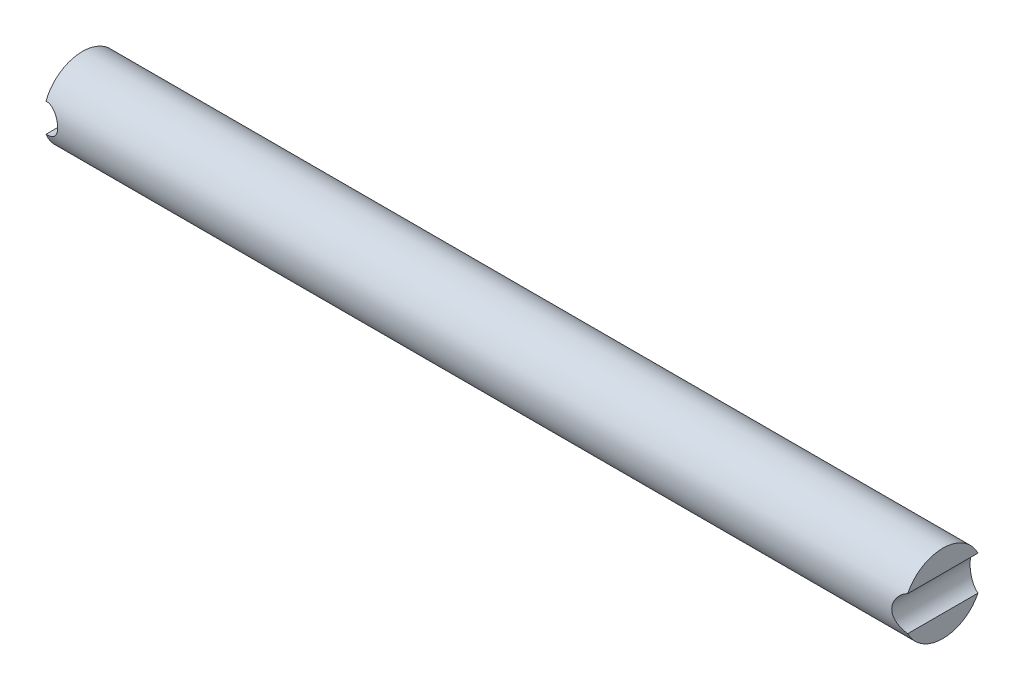
ISO-10303-21;
HEADER;
FILE_DESCRIPTION(('STEP AP214'),'2;1');
FILE_NAME('part.step','',(''),(''),'','','');
FILE_SCHEMA(('AUTOMOTIVE_DESIGN { 1 0 10303 214 1 1 1 1 }'));
ENDSEC;
DATA;
#1=APPLICATION_CONTEXT('core data for automotive mechanical design processes');
#2=APPLICATION_PROTOCOL_DEFINITION('international standard','automotive_design',2000,#1);
#3=PRODUCT_CONTEXT('',#1,'mechanical');
#4=PRODUCT('Part','Part','',(#3));
#5=PRODUCT_RELATED_PRODUCT_CATEGORY('part','',(#4));
#6=PRODUCT_DEFINITION_FORMATION('','',#4);
#7=PRODUCT_DEFINITION_CONTEXT('part definition',#1,'design');
#8=PRODUCT_DEFINITION('design','',#6,#7);
#9=PRODUCT_DEFINITION_SHAPE('','',#8);
#10=(LENGTH_UNIT() NAMED_UNIT(*) SI_UNIT(.MILLI.,.METRE.));
#11=(NAMED_UNIT(*) PLANE_ANGLE_UNIT() SI_UNIT($,.RADIAN.));
#12=(NAMED_UNIT(*) SI_UNIT($,.STERADIAN.) SOLID_ANGLE_UNIT());
#13=UNCERTAINTY_MEASURE_WITH_UNIT(LENGTH_MEASURE(1.E-05),#10,'distance_accuracy_value','');
#14=(GEOMETRIC_REPRESENTATION_CONTEXT(3) GLOBAL_UNCERTAINTY_ASSIGNED_CONTEXT((#13)) GLOBAL_UNIT_ASSIGNED_CONTEXT((#10,
#11,#12)) REPRESENTATION_CONTEXT('',''));
#15=CARTESIAN_POINT('',(0.,0.,0.));
#16=DIRECTION('',(0.,0.,1.));
#17=DIRECTION('',(1.,0.,0.));
#18=AXIS2_PLACEMENT_3D('',#15,#16,#17);
#19=CARTESIAN_POINT('',(505.,0.,0.));
#20=DIRECTION('',(-1.,0.,0.));
#21=DIRECTION('',(0.,0.,1.));
#22=AXIS2_PLACEMENT_3D('',#19,#20,#21);
#23=CYLINDRICAL_SURFACE('',#22,23.);
#24=CARTESIAN_POINT('',(505.,-10.1644512613418,20.6321092124826));
#25=CARTESIAN_POINT('',(504.707414043893,-10.0530025758005,20.6869990679069));
#26=CARTESIAN_POINT('',(504.42055459335,-9.92923591266888,20.7468680871641));
#27=CARTESIAN_POINT('',(503.860027152047,-9.65839120541593,20.8743388120032));
#28=CARTESIAN_POINT('',(503.586352496619,-9.51132510343386,20.9419365513123));
#29=CARTESIAN_POINT('',(503.053815503129,-9.1951992437356,21.0826508582283));
#30=CARTESIAN_POINT('',(502.794943029299,-9.02615480173499,21.1557635679427));
#31=CARTESIAN_POINT('',(502.293104198581,-8.66717269099071,21.30534996242));
#32=CARTESIAN_POINT('',(502.050139948739,-8.47723226346583,21.3818240901702));
#33=CARTESIAN_POINT('',(501.581746352525,-8.07792400535029,21.5358506026298));
#34=CARTESIAN_POINT('',(501.35629257489,-7.86858417028757,21.6134013003497));
#35=CARTESIAN_POINT('',(500.923764242287,-7.43140053535224,21.7675907123967));
#36=CARTESIAN_POINT('',(500.716689447104,-7.20355697739928,21.8442294386321));
#37=CARTESIAN_POINT('',(500.3220654734,-6.73043492082396,21.9946103017921));
#38=CARTESIAN_POINT('',(500.134526194648,-6.48514768740982,22.068350958425));
#39=CARTESIAN_POINT('',(499.780478582291,-5.97866829842752,22.2109138400977));
#40=CARTESIAN_POINT('',(499.613959788001,-5.71748415051817,22.2797385040812));
#41=CARTESIAN_POINT('',(499.30083269447,-5.17652124059429,22.4116551121743));
#42=CARTESIAN_POINT('',(499.154562285211,-4.89652156466043,22.4746450270166));
#43=CARTESIAN_POINT('',(498.886350804962,-4.32332321782072,22.5919108896111));
#44=CARTESIAN_POINT('',(498.764410144585,-4.03012432425393,22.6461866902921));
#45=CARTESIAN_POINT('',(498.546268896842,-3.43282080843677,22.744389974894));
#46=CARTESIAN_POINT('',(498.450052073451,-3.12872320321203,22.7883239841039));
#47=CARTESIAN_POINT('',(498.284452645612,-2.51188506596008,22.8645350541048));
#48=CARTESIAN_POINT('',(498.215067335898,-2.19914540866931,22.8968132900581));
#49=CARTESIAN_POINT('',(498.108696319418,-1.59413425271018,22.9465256349894));
#50=CARTESIAN_POINT('',(498.069488404368,-1.30233509791976,22.9649744551591));
#51=CARTESIAN_POINT('',(498.014857013436,-0.716033605885897,22.9907236439686));
#52=CARTESIAN_POINT('',(497.999432154596,-0.421531426822149,22.9980246608404));
#53=CARTESIAN_POINT('',(497.99255853837,0.167737352662841,23.0012752095955));
#54=CARTESIAN_POINT('',(498.001103655386,0.462503866286947,22.9972276416431));
#55=CARTESIAN_POINT('',(498.042050093995,1.04999853963018,22.9778997260159));
#56=CARTESIAN_POINT('',(498.074450872608,1.34272674559037,22.9626196340057));
#57=CARTESIAN_POINT('',(498.16013598197,1.90690321212547,22.9224562547762));
#58=CARTESIAN_POINT('',(498.212094354093,2.17859801634086,22.8981839940213));
#59=CARTESIAN_POINT('',(498.336273327547,2.71632437305804,22.8406368784286));
#60=CARTESIAN_POINT('',(498.408492927463,2.982356204754,22.8073624685261));
#61=CARTESIAN_POINT('',(498.572485698524,3.50706904103629,22.7325909793261));
#62=CARTESIAN_POINT('',(498.664255280166,3.76575138516767,22.6910954095845));
#63=CARTESIAN_POINT('',(498.866587782997,4.27444441114053,22.6007940583539));
#64=CARTESIAN_POINT('',(498.977158008753,4.52445167684331,22.551985436422));
#65=CARTESIAN_POINT('',(499.221085519505,5.02441834326337,22.4460054755712));
#66=CARTESIAN_POINT('',(499.355189471856,5.27395810892668,22.3885738636936));
#67=CARTESIAN_POINT('',(499.641836238676,5.76096178759822,22.2682346082585));
#68=CARTESIAN_POINT('',(499.794387103863,5.99842036335999,22.2053245771506));
#69=CARTESIAN_POINT('',(500.116987574539,6.46020109730676,22.0754020596999));
#70=CARTESIAN_POINT('',(500.287049339957,6.68451395489586,22.0083867358178));
#71=CARTESIAN_POINT('',(500.643604433382,7.11884004322542,21.8717616049206));
#72=CARTESIAN_POINT('',(500.830098749312,7.32885241287641,21.8021516420619));
#73=CARTESIAN_POINT('',(501.236338988441,7.75217780509137,21.6554473535715));
#74=CARTESIAN_POINT('',(501.457566102114,7.96403640203936,21.5782507255681));
#75=CARTESIAN_POINT('',(501.917167706199,8.36840931871139,21.4246703005381));
#76=CARTESIAN_POINT('',(502.155536576017,8.56092992997262,21.3482862464224));
#77=CARTESIAN_POINT('',(502.647882027168,8.92529137596491,21.1985357794868));
#78=CARTESIAN_POINT('',(502.901834198714,9.09716336563697,21.1251649332562));
#79=CARTESIAN_POINT('',(503.424268393963,9.41932442413769,20.9835002075154));
#80=CARTESIAN_POINT('',(503.692741995261,9.5696258229132,20.9152034384721));
#81=CARTESIAN_POINT('',(504.135270265419,9.79318550747367,20.811108584326));
#82=CARTESIAN_POINT('',(504.305215948234,9.87359563326727,20.7730415847336));
#83=CARTESIAN_POINT('',(504.649419273701,10.0256361583401,20.700089165759));
#84=CARTESIAN_POINT('',(504.823671889795,10.0972762606912,20.6652002413279));
#85=CARTESIAN_POINT('',(505.,10.1644512613418,20.6321092124826));
#86=B_SPLINE_CURVE_WITH_KNOTS('',3,(#24,#25,#26,#27,#28,#29,#30,#31,#32,#33,#34,#35,#36,#37,#38,
#39,#40,#41,#42,#43,#44,#45,#46,#47,#48,#49,#50,#51,#52,#53,#54,#55,#56,#57,#58,#59,#60,#61,#62,
#63,#64,#65,#66,#67,#68,#69,#70,#71,#72,#73,#74,#75,#76,#77,#78,#79,#80,#81,#82,#83,#84,#85),
.UNSPECIFIED.,.F.,.F.,(4,2,2,2,2,2,2,2,2,2,2,2,2,2,2,2,2,2,2,2,2,2,2,2,2,2,2,2,2,2,4),(0.,
0.953145783123443,1.9058046020617,2.8578030789229,3.80992739404682,4.76069847097488,
5.71145711942129,6.66269525181316,7.6134581258451,8.57854981966404,9.54365779996373,
10.5081551906071,11.472555311205,12.3563996061024,13.2401925045036,14.1237595676102,
15.007306520375,15.8394028499413,16.6714580602813,17.5033606313723,18.3355871611475,
19.2018299358088,20.0684521353946,20.9356802465831,21.8029605309459,22.7495515063419,
23.6958335077463,24.6406693200694,25.5849628859705,26.1601825911209,26.7347600136987),.UNSPECIFIED.);
#87=CARTESIAN_POINT('',(505.,-10.1644512613418,20.6321092124826));
#88=VERTEX_POINT('',#87);
#89=CARTESIAN_POINT('',(505.,10.1644512613418,20.6321092124826));
#90=VERTEX_POINT('',#89);
#91=EDGE_CURVE('E82',#88,#90,#86,.T.);
#92=ORIENTED_EDGE('',*,*,#91,.T.);
#93=CARTESIAN_POINT('',(505.,0.,0.));
#94=DIRECTION('',(1.,0.,0.));
#95=DIRECTION('',(0.,0.,-1.));
#96=AXIS2_PLACEMENT_3D('',#93,#94,#95);
#97=CIRCLE('',#96,23.);
#98=CARTESIAN_POINT('',(505.,10.1644512613418,-20.6321092124826));
#99=VERTEX_POINT('',#98);
#100=EDGE_CURVE('E11',#99,#90,#97,.T.);
#101=ORIENTED_EDGE('',*,*,#100,.F.);
#102=CARTESIAN_POINT('',(505.,-10.1644512613418,-20.6321092124826));
#103=CARTESIAN_POINT('',(504.707414043893,-10.0530025758005,-20.6869990679069));
#104=CARTESIAN_POINT('',(504.42055459335,-9.92923591266888,-20.7468680871641));
#105=CARTESIAN_POINT('',(503.860027152047,-9.65839120541593,-20.8743388120032));
#106=CARTESIAN_POINT('',(503.586352496619,-9.51132510343386,-20.9419365513123));
#107=CARTESIAN_POINT('',(503.053815503129,-9.1951992437356,-21.0826508582283));
#108=CARTESIAN_POINT('',(502.794943029299,-9.02615480173499,-21.1557635679427));
#109=CARTESIAN_POINT('',(502.293104198581,-8.66717269099071,-21.30534996242));
#110=CARTESIAN_POINT('',(502.050139948739,-8.47723226346583,-21.3818240901702));
#111=CARTESIAN_POINT('',(501.581746352525,-8.07792400535029,-21.5358506026298));
#112=CARTESIAN_POINT('',(501.35629257489,-7.86858417028757,-21.6134013003497));
#113=CARTESIAN_POINT('',(500.923764242287,-7.43140053535224,-21.7675907123967));
#114=CARTESIAN_POINT('',(500.716689447104,-7.20355697739928,-21.8442294386321));
#115=CARTESIAN_POINT('',(500.3220654734,-6.73043492082396,-21.9946103017921));
#116=CARTESIAN_POINT('',(500.134526194648,-6.48514768740982,-22.068350958425));
#117=CARTESIAN_POINT('',(499.780478582291,-5.97866829842752,-22.2109138400977));
#118=CARTESIAN_POINT('',(499.613959788001,-5.71748415051817,-22.2797385040812));
#119=CARTESIAN_POINT('',(499.30083269447,-5.17652124059429,-22.4116551121743));
#120=CARTESIAN_POINT('',(499.154562285211,-4.89652156466043,-22.4746450270166));
#121=CARTESIAN_POINT('',(498.886350804962,-4.32332321782072,-22.5919108896111));
#122=CARTESIAN_POINT('',(498.764410144585,-4.03012432425393,-22.6461866902921));
#123=CARTESIAN_POINT('',(498.546268896842,-3.43282080843677,-22.744389974894));
#124=CARTESIAN_POINT('',(498.450052073451,-3.12872320321203,-22.7883239841039));
#125=CARTESIAN_POINT('',(498.284452645612,-2.51188506596008,-22.8645350541048));
#126=CARTESIAN_POINT('',(498.215067335898,-2.19914540866931,-22.8968132900581));
#127=CARTESIAN_POINT('',(498.108696319418,-1.59413425271018,-22.9465256349894));
#128=CARTESIAN_POINT('',(498.069488404368,-1.30233509791976,-22.9649744551591));
#129=CARTESIAN_POINT('',(498.014857013436,-0.716033605885897,-22.9907236439686));
#130=CARTESIAN_POINT('',(497.999432154596,-0.421531426822149,-22.9980246608404));
#131=CARTESIAN_POINT('',(497.99255853837,0.167737352662841,-23.0012752095955));
#132=CARTESIAN_POINT('',(498.001103655386,0.462503866286947,-22.9972276416431));
#133=CARTESIAN_POINT('',(498.042050093995,1.04999853963018,-22.9778997260159));
#134=CARTESIAN_POINT('',(498.074450872608,1.34272674559037,-22.9626196340057));
#135=CARTESIAN_POINT('',(498.16013598197,1.90690321212547,-22.9224562547762));
#136=CARTESIAN_POINT('',(498.212094354093,2.17859801634086,-22.8981839940213));
#137=CARTESIAN_POINT('',(498.336273327547,2.71632437305804,-22.8406368784286));
#138=CARTESIAN_POINT('',(498.408492927463,2.982356204754,-22.8073624685261));
#139=CARTESIAN_POINT('',(498.572485698524,3.50706904103629,-22.7325909793261));
#140=CARTESIAN_POINT('',(498.664255280166,3.76575138516767,-22.6910954095845));
#141=CARTESIAN_POINT('',(498.866587782997,4.27444441114053,-22.6007940583539));
#142=CARTESIAN_POINT('',(498.977158008753,4.52445167684331,-22.551985436422));
#143=CARTESIAN_POINT('',(499.221085519505,5.02441834326337,-22.4460054755712));
#144=CARTESIAN_POINT('',(499.355189471856,5.27395810892668,-22.3885738636936));
#145=CARTESIAN_POINT('',(499.641836238676,5.76096178759822,-22.2682346082585));
#146=CARTESIAN_POINT('',(499.794387103863,5.99842036335999,-22.2053245771506));
#147=CARTESIAN_POINT('',(500.116987574539,6.46020109730676,-22.0754020596999));
#148=CARTESIAN_POINT('',(500.287049339957,6.68451395489586,-22.0083867358178));
#149=CARTESIAN_POINT('',(500.643604433382,7.11884004322542,-21.8717616049206));
#150=CARTESIAN_POINT('',(500.830098749312,7.32885241287641,-21.8021516420619));
#151=CARTESIAN_POINT('',(501.236338988441,7.75217780509137,-21.6554473535715));
#152=CARTESIAN_POINT('',(501.457566102114,7.96403640203936,-21.5782507255681));
#153=CARTESIAN_POINT('',(501.917167706199,8.36840931871139,-21.4246703005381));
#154=CARTESIAN_POINT('',(502.155536576017,8.56092992997262,-21.3482862464224));
#155=CARTESIAN_POINT('',(502.647882027168,8.92529137596491,-21.1985357794868));
#156=CARTESIAN_POINT('',(502.901834198714,9.09716336563697,-21.1251649332562));
#157=CARTESIAN_POINT('',(503.424268393963,9.41932442413769,-20.9835002075154));
#158=CARTESIAN_POINT('',(503.692741995261,9.5696258229132,-20.9152034384721));
#159=CARTESIAN_POINT('',(504.135270265419,9.79318550747367,-20.811108584326));
#160=CARTESIAN_POINT('',(504.305215948234,9.87359563326727,-20.7730415847336));
#161=CARTESIAN_POINT('',(504.649419273701,10.0256361583401,-20.700089165759));
#162=CARTESIAN_POINT('',(504.823671889795,10.0972762606912,-20.6652002413279));
#163=CARTESIAN_POINT('',(505.,10.1644512613418,-20.6321092124826));
#164=B_SPLINE_CURVE_WITH_KNOTS('',3,(#102,#103,#104,#105,#106,#107,#108,#109,#110,#111,#112,
#113,#114,#115,#116,#117,#118,#119,#120,#121,#122,#123,#124,#125,#126,#127,#128,#129,#130,#131,
#132,#133,#134,#135,#136,#137,#138,#139,#140,#141,#142,#143,#144,#145,#146,#147,#148,#149,#150,
#151,#152,#153,#154,#155,#156,#157,#158,#159,#160,#161,#162,#163),.UNSPECIFIED.,.F.,.F.,(4,2,2,
2,2,2,2,2,2,2,2,2,2,2,2,2,2,2,2,2,2,2,2,2,2,2,2,2,2,2,4),(0.,0.953145783123443,1.9058046020617,
2.8578030789229,3.80992739404682,4.76069847097488,5.71145711942129,6.66269525181316,
7.6134581258451,8.57854981966404,9.54365779996373,10.5081551906071,11.472555311205,
12.3563996061024,13.2401925045036,14.1237595676102,15.007306520375,15.8394028499413,
16.6714580602813,17.5033606313723,18.3355871611475,19.2018299358088,20.0684521353946,
20.9356802465831,21.8029605309459,22.7495515063419,23.6958335077463,24.6406693200694,
25.5849628859705,26.1601825911209,26.7347600136987),.UNSPECIFIED.);
#165=CARTESIAN_POINT('',(505.,-10.1644512613418,-20.6321092124826));
#166=VERTEX_POINT('',#165);
#167=EDGE_CURVE('E49',#166,#99,#164,.T.);
#168=ORIENTED_EDGE('',*,*,#167,.F.);
#169=EDGE_CURVE('E42',#88,#166,#97,.T.);
#170=ORIENTED_EDGE('',*,*,#169,.F.);
#171=EDGE_LOOP('',(#92,#101,#168,#170));
#172=FACE_BOUND('',#171,.T.);
#173=CARTESIAN_POINT('',(0.,8.43088620688565,-21.3990690864473));
#174=CARTESIAN_POINT('',(0.228496641269385,8.43092041091485,-21.3990265273293));
#175=CARTESIAN_POINT('',(0.456976581417904,8.42159862037208,-21.4027274545529));
#176=CARTESIAN_POINT('',(0.912131400238759,8.38449885567191,-21.4173039257789));
#177=CARTESIAN_POINT('',(1.13880683556491,8.35672681550369,-21.4281771630073));
#178=CARTESIAN_POINT('',(1.5879612429107,8.28310807178676,-21.4567373827173));
#179=CARTESIAN_POINT('',(1.81045190925119,8.23732346496168,-21.4744009514016));
#180=CARTESIAN_POINT('',(2.25047459031507,8.12813543170747,-21.515967215825));
#181=CARTESIAN_POINT('',(2.46800636817131,8.06473116555469,-21.5398702089214));
#182=CARTESIAN_POINT('',(2.89643068471507,7.92095568495012,-21.5931544468174));
#183=CARTESIAN_POINT('',(3.10732995461587,7.8406023552573,-21.6225299132418));
#184=CARTESIAN_POINT('',(3.52150203652607,7.66352468807796,-21.6859224330177));
#185=CARTESIAN_POINT('',(3.72477196842079,7.56679424259492,-21.7199412172166));
#186=CARTESIAN_POINT('',(4.12249743457256,7.35767331436173,-21.791669510703));
#187=CARTESIAN_POINT('',(4.31694977650178,7.24527721906007,-21.8293803412972));
#188=CARTESIAN_POINT('',(4.69596159028358,7.00557530411813,-21.9074828562861));
#189=CARTESIAN_POINT('',(4.88051745025016,6.87826409422355,-21.9478755075795));
#190=CARTESIAN_POINT('',(5.24633828993728,6.60380744870776,-22.0320492585782));
#191=CARTESIAN_POINT('',(5.42712576697765,6.45604698973043,-22.0759013959385));
#192=CARTESIAN_POINT('',(5.77575628451719,6.14612753192496,-22.1641844689098));
#193=CARTESIAN_POINT('',(5.94359901798876,5.98396819177565,-22.20861541822));
#194=CARTESIAN_POINT('',(6.2654032517912,5.64614928466822,-22.2968939877337));
#195=CARTESIAN_POINT('',(6.41935971446524,5.47048486080883,-22.3407413913603));
#196=CARTESIAN_POINT('',(6.71230600860034,5.10678909223636,-22.4266717093585));
#197=CARTESIAN_POINT('',(6.85130102080813,4.91876206492435,-22.4687552314124));
#198=CARTESIAN_POINT('',(7.1177531547074,4.52501646542638,-22.5514079016009));
#199=CARTESIAN_POINT('',(7.24468192102446,4.3189198000826,-22.5918820252759));
#200=CARTESIAN_POINT('',(7.48058751156965,3.89605488536247,-22.6686326749812));
#201=CARTESIAN_POINT('',(7.58957151636702,3.67929094979832,-22.7049108782651));
#202=CARTESIAN_POINT('',(7.78869760014705,3.23650314193726,-22.7722459390212));
#203=CARTESIAN_POINT('',(7.87884099282718,3.01047991657716,-22.8033031605068));
#204=CARTESIAN_POINT('',(8.03943376985206,2.55080568250655,-22.8592865874172));
#205=CARTESIAN_POINT('',(8.10988419298113,2.31715507685903,-22.8842131162215));
#206=CARTESIAN_POINT('',(8.22787608912498,1.85382318886897,-22.9262991763871));
#207=CARTESIAN_POINT('',(8.27624495903299,1.62437778827771,-22.943737443371));
#208=CARTESIAN_POINT('',(8.35373769285525,1.1618465264563,-22.9718040874497));
#209=CARTESIAN_POINT('',(8.38286204051095,0.928760756883349,-22.9824326357175));
#210=CARTESIAN_POINT('',(8.42155553154174,0.460814358668287,-22.9965743240924));
#211=CARTESIAN_POINT('',(8.43112952379809,0.225954184621921,-23.0000892285244));
#212=CARTESIAN_POINT('',(8.4306335103938,-0.243739370100295,-22.9999073332964));
#213=CARTESIAN_POINT('',(8.42056406831456,-0.47857275135153,-22.9962107405384));
#214=CARTESIAN_POINT('',(8.38183681081659,-0.935222684207667,-22.9820591798129));
#215=CARTESIAN_POINT('',(8.35408590503288,-1.15712710064185,-22.9719340271502));
#216=CARTESIAN_POINT('',(8.28111820317053,-1.59775097605909,-22.945498901836));
#217=CARTESIAN_POINT('',(8.23589525934351,-1.8164692858307,-22.9291867522515));
#218=CARTESIAN_POINT('',(8.1284170432264,-2.24907518008107,-22.8908017703951));
#219=CARTESIAN_POINT('',(8.06616772423181,-2.46296442480366,-22.8687309517737));
#220=CARTESIAN_POINT('',(7.92514210221547,-2.88468730071946,-22.8193705740471));
#221=CARTESIAN_POINT('',(7.84635954158573,-3.09251860504691,-22.7920790393185));
#222=CARTESIAN_POINT('',(7.67170699605024,-3.50361582737762,-22.7325408811375));
#223=CARTESIAN_POINT('',(7.57561424203687,-3.70677780102776,-22.700230521015));
#224=CARTESIAN_POINT('',(7.3678036580924,-4.10434442334694,-22.6317269660199));
#225=CARTESIAN_POINT('',(7.25608049715387,-4.29874605412249,-22.5955324473764));
#226=CARTESIAN_POINT('',(7.01780474612443,-4.67764347600683,-22.5201458811747));
#227=CARTESIAN_POINT('',(6.89125092609098,-4.8621384436792,-22.4809535850972));
#228=CARTESIAN_POINT('',(6.62412938955771,-5.22021563945285,-22.4005140395782));
#229=CARTESIAN_POINT('',(6.48356105342063,-5.39379738448356,-22.3592666993155));
#230=CARTESIAN_POINT('',(6.18095566079645,-5.73856726114975,-22.2733508803064));
#231=CARTESIAN_POINT('',(6.01815561322765,-5.90907097541854,-22.2286205024654));
#232=CARTESIAN_POINT('',(5.67891039505398,-6.23580513490297,-22.1391829620375));
#233=CARTESIAN_POINT('',(5.50246937860819,-6.39203989415258,-22.0944757965244));
#234=CARTESIAN_POINT('',(5.13680521095819,-6.68944339974617,-22.0062588328715));
#235=CARTESIAN_POINT('',(4.94757266162097,-6.83060086773496,-21.9627499488959));
#236=CARTESIAN_POINT('',(4.55763192751656,-7.09672675321164,-21.8782074464364));
#237=CARTESIAN_POINT('',(4.35692825524097,-7.22170147431834,-21.8371728674921));
#238=CARTESIAN_POINT('',(3.94076890417775,-7.45711374243121,-21.7579230852813));
#239=CARTESIAN_POINT('',(3.72508945921467,-7.56718300085881,-21.7197869995612));
#240=CARTESIAN_POINT('',(3.28445243798324,-7.76858210355708,-21.648569075671));
#241=CARTESIAN_POINT('',(3.05949884147079,-7.85991988745393,-21.6154850976116));
#242=CARTESIAN_POINT('',(2.60207255475494,-8.02296330031408,-21.5555007796373));
#243=CARTESIAN_POINT('',(2.36960884339942,-8.09469146855889,-21.5285933461609));
#244=CARTESIAN_POINT('',(1.89877779587073,-8.21788786264036,-21.4818676557979));
#245=CARTESIAN_POINT('',(1.66041318216198,-8.26936525289468,-21.462046192552));
#246=CARTESIAN_POINT('',(1.18581460936129,-8.3504541975161,-21.4306291372873));
#247=CARTESIAN_POINT('',(0.949684463991511,-8.38059585087998,-21.4188344270654));
#248=CARTESIAN_POINT('',(0.475709468017056,-8.42082137399062,-21.4030335848061));
#249=CARTESIAN_POINT('',(0.237866609553233,-8.43092564829669,-21.3990195296291));
#250=CARTESIAN_POINT('',(0.,-8.43088620688565,-21.3990690864473));
#251=B_SPLINE_CURVE_WITH_KNOTS('',3,(#173,#174,#175,#176,#177,#178,#179,#180,#181,#182,#183,
#184,#185,#186,#187,#188,#189,#190,#191,#192,#193,#194,#195,#196,#197,#198,#199,#200,#201,#202,
#203,#204,#205,#206,#207,#208,#209,#210,#211,#212,#213,#214,#215,#216,#217,#218,#219,#220,#221,
#222,#223,#224,#225,#226,#227,#228,#229,#230,#231,#232,#233,#234,#235,#236,#237,#238,#239,#240,
#241,#242,#243,#244,#245,#246,#247,#248,#249,#250),.UNSPECIFIED.,.F.,.F.,(4,2,2,2,2,2,2,2,2,2,2,
2,2,2,2,2,2,2,2,2,2,2,2,2,2,2,2,2,2,2,2,2,2,2,2,2,2,2,4),(0.,0.685243898939526,1.37026751562248,
2.05294998145655,2.73566498838282,3.41766316211637,4.09991625594948,4.78241441276267,
5.46515998660848,6.17707610958084,6.88900911282013,7.60119936071379,8.31314219757076,
9.04844972327929,9.78346229795422,10.5184236053708,11.2533461369992,11.9578551168001,
12.6623463869814,13.3666629079292,14.0709592219299,14.7417566813953,15.4127903843511,
16.0835897587244,16.7546434809533,17.4350462721264,18.1156816941857,18.7963736029915,
19.4770956212399,20.1961254255088,20.9149371157523,21.6342827918505,22.353347414942,
23.087798561186,23.8219377525395,24.5552295427379,25.2881891015373,26.0022296862853,
26.7155427716699),.UNSPECIFIED.);
#252=CARTESIAN_POINT('',(0.,8.43088620688565,-21.3990690864473));
#253=VERTEX_POINT('',#252);
#254=CARTESIAN_POINT('',(0.,-8.43088620688565,-21.3990690864473));
#255=VERTEX_POINT('',#254);
#256=EDGE_CURVE('E73',#253,#255,#251,.T.);
#257=ORIENTED_EDGE('',*,*,#256,.F.);
#258=CARTESIAN_POINT('',(0.,0.,0.));
#259=DIRECTION('',(1.,0.,0.));
#260=DIRECTION('',(0.,0.,-1.));
#261=AXIS2_PLACEMENT_3D('',#258,#259,#260);
#262=CIRCLE('',#261,23.);
#263=CARTESIAN_POINT('',(0.,8.43088620688565,21.3990690864473));
#264=VERTEX_POINT('',#263);
#265=EDGE_CURVE('E37',#253,#264,#262,.T.);
#266=ORIENTED_EDGE('',*,*,#265,.T.);
#267=CARTESIAN_POINT('',(0.,8.43088620688565,21.3990690864473));
#268=CARTESIAN_POINT('',(0.228496641269385,8.43092041091485,21.3990265273293));
#269=CARTESIAN_POINT('',(0.456976581417904,8.42159862037208,21.4027274545529));
#270=CARTESIAN_POINT('',(0.912131400238759,8.38449885567191,21.4173039257789));
#271=CARTESIAN_POINT('',(1.13880683556491,8.35672681550369,21.4281771630073));
#272=CARTESIAN_POINT('',(1.5879612429107,8.28310807178676,21.4567373827173));
#273=CARTESIAN_POINT('',(1.81045190925119,8.23732346496168,21.4744009514016));
#274=CARTESIAN_POINT('',(2.25047459031507,8.12813543170747,21.515967215825));
#275=CARTESIAN_POINT('',(2.46800636817131,8.06473116555469,21.5398702089214));
#276=CARTESIAN_POINT('',(2.89643068471507,7.92095568495012,21.5931544468174));
#277=CARTESIAN_POINT('',(3.10732995461587,7.8406023552573,21.6225299132418));
#278=CARTESIAN_POINT('',(3.52150203652607,7.66352468807796,21.6859224330177));
#279=CARTESIAN_POINT('',(3.72477196842079,7.56679424259492,21.7199412172166));
#280=CARTESIAN_POINT('',(4.12249743457256,7.35767331436173,21.791669510703));
#281=CARTESIAN_POINT('',(4.31694977650178,7.24527721906007,21.8293803412972));
#282=CARTESIAN_POINT('',(4.69596159028358,7.00557530411813,21.9074828562861));
#283=CARTESIAN_POINT('',(4.88051745025016,6.87826409422355,21.9478755075795));
#284=CARTESIAN_POINT('',(5.24633828993728,6.60380744870776,22.0320492585782));
#285=CARTESIAN_POINT('',(5.42712576697765,6.45604698973043,22.0759013959385));
#286=CARTESIAN_POINT('',(5.77575628451719,6.14612753192496,22.1641844689098));
#287=CARTESIAN_POINT('',(5.94359901798876,5.98396819177565,22.20861541822));
#288=CARTESIAN_POINT('',(6.2654032517912,5.64614928466822,22.2968939877337));
#289=CARTESIAN_POINT('',(6.41935971446524,5.47048486080883,22.3407413913603));
#290=CARTESIAN_POINT('',(6.71230600860034,5.10678909223636,22.4266717093585));
#291=CARTESIAN_POINT('',(6.85130102080813,4.91876206492435,22.4687552314124));
#292=CARTESIAN_POINT('',(7.1177531547074,4.52501646542638,22.5514079016009));
#293=CARTESIAN_POINT('',(7.24468192102446,4.3189198000826,22.5918820252759));
#294=CARTESIAN_POINT('',(7.48058751156965,3.89605488536247,22.6686326749812));
#295=CARTESIAN_POINT('',(7.58957151636702,3.67929094979832,22.7049108782651));
#296=CARTESIAN_POINT('',(7.78869760014705,3.23650314193726,22.7722459390212));
#297=CARTESIAN_POINT('',(7.87884099282718,3.01047991657716,22.8033031605068));
#298=CARTESIAN_POINT('',(8.03943376985206,2.55080568250655,22.8592865874172));
#299=CARTESIAN_POINT('',(8.10988419298113,2.31715507685903,22.8842131162215));
#300=CARTESIAN_POINT('',(8.22787608912498,1.85382318886897,22.9262991763871));
#301=CARTESIAN_POINT('',(8.27624495903299,1.62437778827771,22.943737443371));
#302=CARTESIAN_POINT('',(8.35373769285525,1.1618465264563,22.9718040874497));
#303=CARTESIAN_POINT('',(8.38286204051095,0.928760756883349,22.9824326357175));
#304=CARTESIAN_POINT('',(8.42155553154174,0.460814358668287,22.9965743240924));
#305=CARTESIAN_POINT('',(8.43112952379809,0.225954184621921,23.0000892285244));
#306=CARTESIAN_POINT('',(8.4306335103938,-0.243739370100295,22.9999073332964));
#307=CARTESIAN_POINT('',(8.42056406831456,-0.47857275135153,22.9962107405384));
#308=CARTESIAN_POINT('',(8.38183681081659,-0.935222684207667,22.9820591798129));
#309=CARTESIAN_POINT('',(8.35408590503288,-1.15712710064185,22.9719340271502));
#310=CARTESIAN_POINT('',(8.28111820317053,-1.59775097605909,22.945498901836));
#311=CARTESIAN_POINT('',(8.23589525934351,-1.8164692858307,22.9291867522515));
#312=CARTESIAN_POINT('',(8.1284170432264,-2.24907518008107,22.8908017703951));
#313=CARTESIAN_POINT('',(8.06616772423181,-2.46296442480366,22.8687309517737));
#314=CARTESIAN_POINT('',(7.92514210221547,-2.88468730071946,22.8193705740471));
#315=CARTESIAN_POINT('',(7.84635954158573,-3.09251860504691,22.7920790393185));
#316=CARTESIAN_POINT('',(7.67170699605024,-3.50361582737762,22.7325408811375));
#317=CARTESIAN_POINT('',(7.57561424203687,-3.70677780102776,22.700230521015));
#318=CARTESIAN_POINT('',(7.3678036580924,-4.10434442334694,22.6317269660199));
#319=CARTESIAN_POINT('',(7.25608049715387,-4.29874605412249,22.5955324473764));
#320=CARTESIAN_POINT('',(7.01780474612443,-4.67764347600683,22.5201458811747));
#321=CARTESIAN_POINT('',(6.89125092609098,-4.8621384436792,22.4809535850972));
#322=CARTESIAN_POINT('',(6.62412938955771,-5.22021563945285,22.4005140395782));
#323=CARTESIAN_POINT('',(6.48356105342063,-5.39379738448356,22.3592666993155));
#324=CARTESIAN_POINT('',(6.18095566079645,-5.73856726114975,22.2733508803064));
#325=CARTESIAN_POINT('',(6.01815561322765,-5.90907097541854,22.2286205024654));
#326=CARTESIAN_POINT('',(5.67891039505398,-6.23580513490297,22.1391829620375));
#327=CARTESIAN_POINT('',(5.50246937860819,-6.39203989415258,22.0944757965244));
#328=CARTESIAN_POINT('',(5.13680521095819,-6.68944339974617,22.0062588328715));
#329=CARTESIAN_POINT('',(4.94757266162097,-6.83060086773496,21.9627499488959));
#330=CARTESIAN_POINT('',(4.55763192751656,-7.09672675321164,21.8782074464364));
#331=CARTESIAN_POINT('',(4.35692825524097,-7.22170147431834,21.8371728674921));
#332=CARTESIAN_POINT('',(3.94076890417775,-7.45711374243121,21.7579230852813));
#333=CARTESIAN_POINT('',(3.72508945921467,-7.56718300085881,21.7197869995612));
#334=CARTESIAN_POINT('',(3.28445243798324,-7.76858210355708,21.648569075671));
#335=CARTESIAN_POINT('',(3.05949884147079,-7.85991988745393,21.6154850976116));
#336=CARTESIAN_POINT('',(2.60207255475494,-8.02296330031408,21.5555007796373));
#337=CARTESIAN_POINT('',(2.36960884339942,-8.09469146855889,21.5285933461609));
#338=CARTESIAN_POINT('',(1.89877779587073,-8.21788786264036,21.4818676557979));
#339=CARTESIAN_POINT('',(1.66041318216198,-8.26936525289468,21.462046192552));
#340=CARTESIAN_POINT('',(1.18581460936129,-8.3504541975161,21.4306291372873));
#341=CARTESIAN_POINT('',(0.949684463991511,-8.38059585087998,21.4188344270654));
#342=CARTESIAN_POINT('',(0.475709468017056,-8.42082137399062,21.4030335848061));
#343=CARTESIAN_POINT('',(0.237866609553233,-8.43092564829669,21.3990195296291));
#344=CARTESIAN_POINT('',(0.,-8.43088620688565,21.3990690864473));
#345=B_SPLINE_CURVE_WITH_KNOTS('',3,(#267,#268,#269,#270,#271,#272,#273,#274,#275,#276,#277,
#278,#279,#280,#281,#282,#283,#284,#285,#286,#287,#288,#289,#290,#291,#292,#293,#294,#295,#296,
#297,#298,#299,#300,#301,#302,#303,#304,#305,#306,#307,#308,#309,#310,#311,#312,#313,#314,#315,
#316,#317,#318,#319,#320,#321,#322,#323,#324,#325,#326,#327,#328,#329,#330,#331,#332,#333,#334,
#335,#336,#337,#338,#339,#340,#341,#342,#343,#344),.UNSPECIFIED.,.F.,.F.,(4,2,2,2,2,2,2,2,2,2,2,
2,2,2,2,2,2,2,2,2,2,2,2,2,2,2,2,2,2,2,2,2,2,2,2,2,2,2,4),(0.,0.685243898939526,1.37026751562248,
2.05294998145655,2.73566498838282,3.41766316211637,4.09991625594948,4.78241441276267,
5.46515998660848,6.17707610958084,6.88900911282013,7.60119936071379,8.31314219757076,
9.04844972327929,9.78346229795422,10.5184236053708,11.2533461369992,11.9578551168001,
12.6623463869814,13.3666629079292,14.0709592219299,14.7417566813953,15.4127903843511,
16.0835897587244,16.7546434809533,17.4350462721264,18.1156816941857,18.7963736029915,
19.4770956212399,20.1961254255088,20.9149371157523,21.6342827918505,22.353347414942,
23.087798561186,23.8219377525395,24.5552295427379,25.2881891015373,26.0022296862853,
26.7155427716699),.UNSPECIFIED.);
#346=CARTESIAN_POINT('',(0.,-8.43088620688565,21.3990690864473));
#347=VERTEX_POINT('',#346);
#348=EDGE_CURVE('E57',#264,#347,#345,.T.);
#349=ORIENTED_EDGE('',*,*,#348,.T.);
#350=EDGE_CURVE('E87',#347,#255,#262,.T.);
#351=ORIENTED_EDGE('',*,*,#350,.T.);
#352=EDGE_LOOP('',(#257,#266,#349,#351));
#353=FACE_BOUND('',#352,.T.);
#354=ADVANCED_FACE('F34',(#172,#353),#23,.T.);
#355=CARTESIAN_POINT('',(505.,0.,0.));
#356=DIRECTION('',(1.,0.,0.));
#357=DIRECTION('',(0.,0.,-1.));
#358=AXIS2_PLACEMENT_3D('',#355,#356,#357);
#359=PLANE('',#358);
#360=ORIENTED_EDGE('',*,*,#169,.T.);
#361=DIRECTION('',(0.,0.,-1.));
#362=VECTOR('',#361,1.);
#363=CARTESIAN_POINT('',(505.,-10.1644512613418,23.001));
#364=LINE('',#363,#362);
#365=EDGE_CURVE('E137',#88,#166,#364,.T.);
#366=ORIENTED_EDGE('',*,*,#365,.F.);
#367=EDGE_LOOP('',(#360,#366));
#368=FACE_BOUND('',#367,.T.);
#369=ADVANCED_FACE('F126',(#368),#359,.T.);
#370=ORIENTED_EDGE('',*,*,#100,.T.);
#371=DIRECTION('',(0.,0.,-1.));
#372=VECTOR('',#371,1.);
#373=CARTESIAN_POINT('',(505.,10.1644512613418,23.001));
#374=LINE('',#373,#372);
#375=EDGE_CURVE('E140',#99,#90,#374,.F.);
#376=ORIENTED_EDGE('',*,*,#375,.F.);
#377=EDGE_LOOP('',(#370,#376));
#378=FACE_BOUND('',#377,.T.);
#379=ADVANCED_FACE('F123',(#378),#359,.T.);
#380=CARTESIAN_POINT('',(0.,0.,0.));
#381=DIRECTION('',(1.,0.,0.));
#382=DIRECTION('',(0.,0.,-1.));
#383=AXIS2_PLACEMENT_3D('',#380,#381,#382);
#384=PLANE('',#383);
#385=DIRECTION('',(0.,0.,-1.));
#386=VECTOR('',#385,1.);
#387=CARTESIAN_POINT('',(0.,-8.43088620688565,23.001));
#388=LINE('',#387,#386);
#389=EDGE_CURVE('E76',#347,#255,#388,.T.);
#390=ORIENTED_EDGE('',*,*,#389,.T.);
#391=ORIENTED_EDGE('',*,*,#350,.F.);
#392=EDGE_LOOP('',(#390,#391));
#393=FACE_BOUND('',#392,.T.);
#394=ADVANCED_FACE('F86',(#393),#384,.F.);
#395=DIRECTION('',(0.,0.,-1.));
#396=VECTOR('',#395,1.);
#397=CARTESIAN_POINT('',(0.,8.43088620688565,23.001));
#398=LINE('',#397,#396);
#399=EDGE_CURVE('E77',#253,#264,#398,.F.);
#400=ORIENTED_EDGE('',*,*,#399,.T.);
#401=ORIENTED_EDGE('',*,*,#265,.F.);
#402=EDGE_LOOP('',(#400,#401));
#403=FACE_BOUND('',#402,.T.);
#404=ADVANCED_FACE('F116',(#403),#384,.F.);
#405=CARTESIAN_POINT('',(0.,0.,23.001));
#406=DIRECTION('',(0.,0.,-1.));
#407=DIRECTION('',(-1.,0.,0.));
#408=AXIS2_PLACEMENT_3D('',#405,#406,#407);
#409=CYLINDRICAL_SURFACE('',#408,8.43088620688565);
#410=ORIENTED_EDGE('',*,*,#348,.F.);
#411=ORIENTED_EDGE('',*,*,#399,.F.);
#412=ORIENTED_EDGE('',*,*,#256,.T.);
#413=ORIENTED_EDGE('',*,*,#389,.F.);
#414=EDGE_LOOP('',(#410,#411,#412,#413));
#415=FACE_BOUND('',#414,.T.);
#416=ADVANCED_FACE('F75',(#415),#409,.F.);
#417=CARTESIAN_POINT('',(508.872347898368,0.,23.001));
#418=DIRECTION('',(0.,0.,-1.));
#419=DIRECTION('',(-1.,0.,0.));
#420=AXIS2_PLACEMENT_3D('',#417,#418,#419);
#421=CYLINDRICAL_SURFACE('',#420,10.8770927958802);
#422=ORIENTED_EDGE('',*,*,#365,.T.);
#423=ORIENTED_EDGE('',*,*,#167,.T.);
#424=ORIENTED_EDGE('',*,*,#375,.T.);
#425=ORIENTED_EDGE('',*,*,#91,.F.);
#426=EDGE_LOOP('',(#422,#423,#424,#425));
#427=FACE_BOUND('',#426,.T.);
#428=ADVANCED_FACE('F122',(#427),#421,.F.);
#429=CLOSED_SHELL('',(#354,#369,#379,#394,#404,#416,#428));
#430=MANIFOLD_SOLID_BREP('B2',#429);
#431=ADVANCED_BREP_SHAPE_REPRESENTATION('',(#18,#430),#14);
#432=SHAPE_DEFINITION_REPRESENTATION(#9,#431);
ENDSEC;
END-ISO-10303-21;
